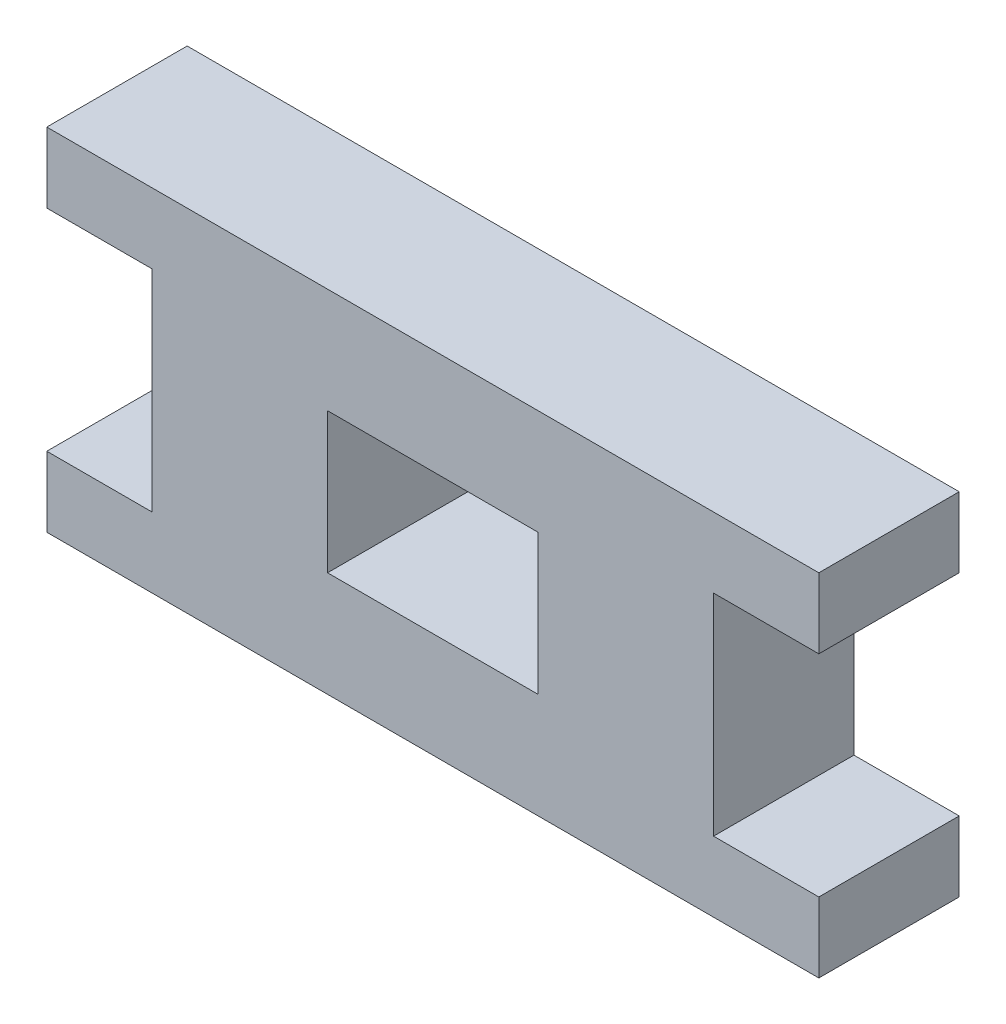
ISO-10303-21;
HEADER;
FILE_DESCRIPTION(('STEP AP214'),'2;1');
FILE_NAME('part.step','',(''),(''),'','','');
FILE_SCHEMA(('AUTOMOTIVE_DESIGN { 1 0 10303 214 1 1 1 1 }'));
ENDSEC;
DATA;
#1=APPLICATION_CONTEXT('core data for automotive mechanical design processes');
#2=APPLICATION_PROTOCOL_DEFINITION('international standard','automotive_design',2000,#1);
#3=PRODUCT_CONTEXT('',#1,'mechanical');
#4=PRODUCT('Part','Part','',(#3));
#5=PRODUCT_RELATED_PRODUCT_CATEGORY('part','',(#4));
#6=PRODUCT_DEFINITION_FORMATION('','',#4);
#7=PRODUCT_DEFINITION_CONTEXT('part definition',#1,'design');
#8=PRODUCT_DEFINITION('design','',#6,#7);
#9=PRODUCT_DEFINITION_SHAPE('','',#8);
#10=(LENGTH_UNIT() NAMED_UNIT(*) SI_UNIT(.MILLI.,.METRE.));
#11=(NAMED_UNIT(*) PLANE_ANGLE_UNIT() SI_UNIT($,.RADIAN.));
#12=(NAMED_UNIT(*) SI_UNIT($,.STERADIAN.) SOLID_ANGLE_UNIT());
#13=UNCERTAINTY_MEASURE_WITH_UNIT(LENGTH_MEASURE(1.E-05),#10,'distance_accuracy_value','');
#14=(GEOMETRIC_REPRESENTATION_CONTEXT(3) GLOBAL_UNCERTAINTY_ASSIGNED_CONTEXT((#13)) GLOBAL_UNIT_ASSIGNED_CONTEXT((#10,
#11,#12)) REPRESENTATION_CONTEXT('',''));
#15=CARTESIAN_POINT('',(0.,0.,0.));
#16=DIRECTION('',(0.,0.,1.));
#17=DIRECTION('',(1.,0.,0.));
#18=AXIS2_PLACEMENT_3D('',#15,#16,#17);
#19=CARTESIAN_POINT('',(0.,0.,20.));
#20=DIRECTION('',(0.,0.,-1.));
#21=DIRECTION('',(-1.,0.,0.));
#22=AXIS2_PLACEMENT_3D('',#19,#20,#21);
#23=PLANE('',#22);
#24=DIRECTION('',(-1.,0.,0.));
#25=VECTOR('',#24,1.);
#26=CARTESIAN_POINT('',(40.,25.,20.));
#27=LINE('',#26,#25);
#28=CARTESIAN_POINT('',(55.,25.,20.));
#29=VERTEX_POINT('',#28);
#30=CARTESIAN_POINT('',(-55.,25.,20.));
#31=VERTEX_POINT('',#30);
#32=EDGE_CURVE('E205',#29,#31,#27,.T.);
#33=ORIENTED_EDGE('',*,*,#32,.T.);
#34=DIRECTION('',(0.,-1.,0.));
#35=VECTOR('',#34,1.);
#36=CARTESIAN_POINT('',(-55.,25.,20.));
#37=LINE('',#36,#35);
#38=CARTESIAN_POINT('',(-55.,15.,20.));
#39=VERTEX_POINT('',#38);
#40=EDGE_CURVE('E208',#31,#39,#37,.T.);
#41=ORIENTED_EDGE('',*,*,#40,.T.);
#42=DIRECTION('',(1.,0.,0.));
#43=VECTOR('',#42,1.);
#44=CARTESIAN_POINT('',(-40.,15.,20.));
#45=LINE('',#44,#43);
#46=CARTESIAN_POINT('',(-40.,15.,20.));
#47=VERTEX_POINT('',#46);
#48=EDGE_CURVE('E212',#39,#47,#45,.T.);
#49=ORIENTED_EDGE('',*,*,#48,.T.);
#50=DIRECTION('',(0.,-1.,0.));
#51=VECTOR('',#50,1.);
#52=CARTESIAN_POINT('',(-40.,-15.,20.));
#53=LINE('',#52,#51);
#54=CARTESIAN_POINT('',(-40.,-15.,20.));
#55=VERTEX_POINT('',#54);
#56=EDGE_CURVE('E215',#47,#55,#53,.T.);
#57=ORIENTED_EDGE('',*,*,#56,.T.);
#58=DIRECTION('',(-1.,0.,0.));
#59=VECTOR('',#58,1.);
#60=CARTESIAN_POINT('',(-40.,-15.,20.));
#61=LINE('',#60,#59);
#62=CARTESIAN_POINT('',(-55.,-15.,20.));
#63=VERTEX_POINT('',#62);
#64=EDGE_CURVE('E218',#55,#63,#61,.T.);
#65=ORIENTED_EDGE('',*,*,#64,.T.);
#66=DIRECTION('',(0.,-1.,0.));
#67=VECTOR('',#66,1.);
#68=CARTESIAN_POINT('',(-55.,-25.,20.));
#69=LINE('',#68,#67);
#70=CARTESIAN_POINT('',(-55.,-25.,20.));
#71=VERTEX_POINT('',#70);
#72=EDGE_CURVE('E221',#63,#71,#69,.T.);
#73=ORIENTED_EDGE('',*,*,#72,.T.);
#74=DIRECTION('',(1.,0.,0.));
#75=VECTOR('',#74,1.);
#76=CARTESIAN_POINT('',(-40.,-25.,20.));
#77=LINE('',#76,#75);
#78=CARTESIAN_POINT('',(55.,-25.,20.));
#79=VERTEX_POINT('',#78);
#80=EDGE_CURVE('E224',#71,#79,#77,.T.);
#81=ORIENTED_EDGE('',*,*,#80,.T.);
#82=DIRECTION('',(0.,1.,0.));
#83=VECTOR('',#82,1.);
#84=CARTESIAN_POINT('',(55.,-25.,20.));
#85=LINE('',#84,#83);
#86=CARTESIAN_POINT('',(55.,-15.,20.));
#87=VERTEX_POINT('',#86);
#88=EDGE_CURVE('E227',#79,#87,#85,.T.);
#89=ORIENTED_EDGE('',*,*,#88,.T.);
#90=DIRECTION('',(-1.,0.,0.));
#91=VECTOR('',#90,1.);
#92=CARTESIAN_POINT('',(40.,-15.,20.));
#93=LINE('',#92,#91);
#94=CARTESIAN_POINT('',(40.,-15.,20.));
#95=VERTEX_POINT('',#94);
#96=EDGE_CURVE('E230',#87,#95,#93,.T.);
#97=ORIENTED_EDGE('',*,*,#96,.T.);
#98=DIRECTION('',(0.,1.,0.));
#99=VECTOR('',#98,1.);
#100=CARTESIAN_POINT('',(40.,-15.,20.));
#101=LINE('',#100,#99);
#102=CARTESIAN_POINT('',(40.,15.,20.));
#103=VERTEX_POINT('',#102);
#104=EDGE_CURVE('E233',#95,#103,#101,.T.);
#105=ORIENTED_EDGE('',*,*,#104,.T.);
#106=DIRECTION('',(1.,0.,0.));
#107=VECTOR('',#106,1.);
#108=CARTESIAN_POINT('',(40.,15.,20.));
#109=LINE('',#108,#107);
#110=CARTESIAN_POINT('',(55.,15.,20.));
#111=VERTEX_POINT('',#110);
#112=EDGE_CURVE('E236',#103,#111,#109,.T.);
#113=ORIENTED_EDGE('',*,*,#112,.T.);
#114=DIRECTION('',(0.,1.,0.));
#115=VECTOR('',#114,1.);
#116=CARTESIAN_POINT('',(55.,25.,20.));
#117=LINE('',#116,#115);
#118=EDGE_CURVE('E239',#111,#29,#117,.T.);
#119=ORIENTED_EDGE('',*,*,#118,.T.);
#120=EDGE_LOOP('',(#33,#41,#49,#57,#65,#73,#81,#89,#97,#105,#113,#119));
#121=FACE_BOUND('',#120,.T.);
#122=DIRECTION('',(0.,1.,0.));
#123=VECTOR('',#122,1.);
#124=CARTESIAN_POINT('',(15.,10.,20.));
#125=LINE('',#124,#123);
#126=CARTESIAN_POINT('',(15.,-10.,20.));
#127=VERTEX_POINT('',#126);
#128=CARTESIAN_POINT('',(15.,10.,20.));
#129=VERTEX_POINT('',#128);
#130=EDGE_CURVE('E157',#127,#129,#125,.T.);
#131=ORIENTED_EDGE('',*,*,#130,.F.);
#132=DIRECTION('',(1.,0.,0.));
#133=VECTOR('',#132,1.);
#134=CARTESIAN_POINT('',(-15.,-10.,20.));
#135=LINE('',#134,#133);
#136=CARTESIAN_POINT('',(-15.,-10.,20.));
#137=VERTEX_POINT('',#136);
#138=EDGE_CURVE('E183',#137,#127,#135,.T.);
#139=ORIENTED_EDGE('',*,*,#138,.F.);
#140=DIRECTION('',(0.,-1.,0.));
#141=VECTOR('',#140,1.);
#142=CARTESIAN_POINT('',(-15.,10.,20.));
#143=LINE('',#142,#141);
#144=CARTESIAN_POINT('',(-15.,10.,20.));
#145=VERTEX_POINT('',#144);
#146=EDGE_CURVE('E179',#145,#137,#143,.T.);
#147=ORIENTED_EDGE('',*,*,#146,.F.);
#148=DIRECTION('',(-1.,0.,0.));
#149=VECTOR('',#148,1.);
#150=CARTESIAN_POINT('',(-15.,10.,20.));
#151=LINE('',#150,#149);
#152=EDGE_CURVE('E166',#129,#145,#151,.T.);
#153=ORIENTED_EDGE('',*,*,#152,.F.);
#154=EDGE_LOOP('',(#131,#139,#147,#153));
#155=FACE_BOUND('',#154,.T.);
#156=ADVANCED_FACE('F43',(#121,#155),#23,.F.);
#157=CARTESIAN_POINT('',(0.,0.,0.));
#158=DIRECTION('',(0.,0.,-1.));
#159=DIRECTION('',(-1.,0.,0.));
#160=AXIS2_PLACEMENT_3D('',#157,#158,#159);
#161=PLANE('',#160);
#162=DIRECTION('',(-1.,0.,0.));
#163=VECTOR('',#162,1.);
#164=CARTESIAN_POINT('',(-40.,25.,0.));
#165=LINE('',#164,#163);
#166=CARTESIAN_POINT('',(55.,25.,0.));
#167=VERTEX_POINT('',#166);
#168=CARTESIAN_POINT('',(-55.,25.,0.));
#169=VERTEX_POINT('',#168);
#170=EDGE_CURVE('E175',#167,#169,#165,.T.);
#171=ORIENTED_EDGE('',*,*,#170,.F.);
#172=DIRECTION('',(0.,1.,0.));
#173=VECTOR('',#172,1.);
#174=CARTESIAN_POINT('',(55.,25.,0.));
#175=LINE('',#174,#173);
#176=CARTESIAN_POINT('',(55.,15.,0.));
#177=VERTEX_POINT('',#176);
#178=EDGE_CURVE('E209',#177,#167,#175,.T.);
#179=ORIENTED_EDGE('',*,*,#178,.F.);
#180=DIRECTION('',(1.,0.,0.));
#181=VECTOR('',#180,1.);
#182=CARTESIAN_POINT('',(40.,15.,0.));
#183=LINE('',#182,#181);
#184=CARTESIAN_POINT('',(40.,15.,0.));
#185=VERTEX_POINT('',#184);
#186=EDGE_CURVE('E273',#185,#177,#183,.T.);
#187=ORIENTED_EDGE('',*,*,#186,.F.);
#188=DIRECTION('',(0.,1.,0.));
#189=VECTOR('',#188,1.);
#190=CARTESIAN_POINT('',(40.,-15.,0.));
#191=LINE('',#190,#189);
#192=CARTESIAN_POINT('',(40.,-15.,0.));
#193=VERTEX_POINT('',#192);
#194=EDGE_CURVE('E270',#193,#185,#191,.T.);
#195=ORIENTED_EDGE('',*,*,#194,.F.);
#196=DIRECTION('',(-1.,0.,0.));
#197=VECTOR('',#196,1.);
#198=CARTESIAN_POINT('',(40.,-15.,0.));
#199=LINE('',#198,#197);
#200=CARTESIAN_POINT('',(55.,-15.,0.));
#201=VERTEX_POINT('',#200);
#202=EDGE_CURVE('E267',#201,#193,#199,.T.);
#203=ORIENTED_EDGE('',*,*,#202,.F.);
#204=DIRECTION('',(0.,1.,0.));
#205=VECTOR('',#204,1.);
#206=CARTESIAN_POINT('',(55.,-25.,0.));
#207=LINE('',#206,#205);
#208=CARTESIAN_POINT('',(55.,-25.,0.));
#209=VERTEX_POINT('',#208);
#210=EDGE_CURVE('E264',#209,#201,#207,.T.);
#211=ORIENTED_EDGE('',*,*,#210,.F.);
#212=DIRECTION('',(1.,0.,0.));
#213=VECTOR('',#212,1.);
#214=CARTESIAN_POINT('',(40.,-25.,0.));
#215=LINE('',#214,#213);
#216=CARTESIAN_POINT('',(-55.,-25.,0.));
#217=VERTEX_POINT('',#216);
#218=EDGE_CURVE('E261',#217,#209,#215,.T.);
#219=ORIENTED_EDGE('',*,*,#218,.F.);
#220=DIRECTION('',(0.,-1.,0.));
#221=VECTOR('',#220,1.);
#222=CARTESIAN_POINT('',(-55.,-25.,0.));
#223=LINE('',#222,#221);
#224=CARTESIAN_POINT('',(-55.,-15.,0.));
#225=VERTEX_POINT('',#224);
#226=EDGE_CURVE('E257',#225,#217,#223,.T.);
#227=ORIENTED_EDGE('',*,*,#226,.F.);
#228=DIRECTION('',(-1.,0.,0.));
#229=VECTOR('',#228,1.);
#230=CARTESIAN_POINT('',(-40.,-15.,0.));
#231=LINE('',#230,#229);
#232=CARTESIAN_POINT('',(-40.,-15.,0.));
#233=VERTEX_POINT('',#232);
#234=EDGE_CURVE('E254',#233,#225,#231,.T.);
#235=ORIENTED_EDGE('',*,*,#234,.F.);
#236=DIRECTION('',(0.,-1.,0.));
#237=VECTOR('',#236,1.);
#238=CARTESIAN_POINT('',(-40.,-15.,0.));
#239=LINE('',#238,#237);
#240=CARTESIAN_POINT('',(-40.,15.,0.));
#241=VERTEX_POINT('',#240);
#242=EDGE_CURVE('E251',#241,#233,#239,.T.);
#243=ORIENTED_EDGE('',*,*,#242,.F.);
#244=DIRECTION('',(1.,0.,0.));
#245=VECTOR('',#244,1.);
#246=CARTESIAN_POINT('',(-40.,15.,0.));
#247=LINE('',#246,#245);
#248=CARTESIAN_POINT('',(-55.,15.,0.));
#249=VERTEX_POINT('',#248);
#250=EDGE_CURVE('E248',#249,#241,#247,.T.);
#251=ORIENTED_EDGE('',*,*,#250,.F.);
#252=DIRECTION('',(0.,-1.,0.));
#253=VECTOR('',#252,1.);
#254=CARTESIAN_POINT('',(-55.,25.,0.));
#255=LINE('',#254,#253);
#256=EDGE_CURVE('E245',#169,#249,#255,.T.);
#257=ORIENTED_EDGE('',*,*,#256,.F.);
#258=EDGE_LOOP('',(#171,#179,#187,#195,#203,#211,#219,#227,#235,#243,#251,#257));
#259=FACE_BOUND('',#258,.T.);
#260=DIRECTION('',(1.,0.,0.));
#261=VECTOR('',#260,1.);
#262=CARTESIAN_POINT('',(-15.,-10.,0.));
#263=LINE('',#262,#261);
#264=CARTESIAN_POINT('',(-15.,-10.,0.));
#265=VERTEX_POINT('',#264);
#266=CARTESIAN_POINT('',(15.,-10.,0.));
#267=VERTEX_POINT('',#266);
#268=EDGE_CURVE('E167',#265,#267,#263,.T.);
#269=ORIENTED_EDGE('',*,*,#268,.T.);
#270=DIRECTION('',(0.,1.,0.));
#271=VECTOR('',#270,1.);
#272=CARTESIAN_POINT('',(15.,10.,0.));
#273=LINE('',#272,#271);
#274=CARTESIAN_POINT('',(15.,10.,0.));
#275=VERTEX_POINT('',#274);
#276=EDGE_CURVE('E67',#267,#275,#273,.T.);
#277=ORIENTED_EDGE('',*,*,#276,.T.);
#278=DIRECTION('',(-1.,0.,0.));
#279=VECTOR('',#278,1.);
#280=CARTESIAN_POINT('',(-15.,10.,0.));
#281=LINE('',#280,#279);
#282=CARTESIAN_POINT('',(-15.,10.,0.));
#283=VERTEX_POINT('',#282);
#284=EDGE_CURVE('E173',#275,#283,#281,.T.);
#285=ORIENTED_EDGE('',*,*,#284,.T.);
#286=DIRECTION('',(0.,-1.,0.));
#287=VECTOR('',#286,1.);
#288=CARTESIAN_POINT('',(-15.,10.,0.));
#289=LINE('',#288,#287);
#290=EDGE_CURVE('E192',#283,#265,#289,.T.);
#291=ORIENTED_EDGE('',*,*,#290,.T.);
#292=EDGE_LOOP('',(#269,#277,#285,#291));
#293=FACE_BOUND('',#292,.T.);
#294=ADVANCED_FACE('F330',(#259,#293),#161,.T.);
#295=CARTESIAN_POINT('',(-40.,25.,20.));
#296=DIRECTION('',(0.,-1.,0.));
#297=DIRECTION('',(0.,0.,-1.));
#298=AXIS2_PLACEMENT_3D('',#295,#296,#297);
#299=PLANE('',#298);
#300=ORIENTED_EDGE('',*,*,#170,.T.);
#301=DIRECTION('',(0.,0.,-1.));
#302=VECTOR('',#301,1.);
#303=CARTESIAN_POINT('',(-55.,25.,20.));
#304=LINE('',#303,#302);
#305=EDGE_CURVE('E11',#31,#169,#304,.T.);
#306=ORIENTED_EDGE('',*,*,#305,.F.);
#307=ORIENTED_EDGE('',*,*,#32,.F.);
#308=DIRECTION('',(0.,0.,-1.));
#309=VECTOR('',#308,1.);
#310=CARTESIAN_POINT('',(55.,25.,20.));
#311=LINE('',#310,#309);
#312=EDGE_CURVE('E242',#29,#167,#311,.T.);
#313=ORIENTED_EDGE('',*,*,#312,.T.);
#314=EDGE_LOOP('',(#300,#306,#307,#313));
#315=FACE_BOUND('',#314,.T.);
#316=ADVANCED_FACE('F45',(#315),#299,.F.);
#317=CARTESIAN_POINT('',(-55.,25.,20.));
#318=DIRECTION('',(1.,0.,0.));
#319=DIRECTION('',(0.,0.,-1.));
#320=AXIS2_PLACEMENT_3D('',#317,#318,#319);
#321=PLANE('',#320);
#322=ORIENTED_EDGE('',*,*,#256,.T.);
#323=DIRECTION('',(0.,0.,-1.));
#324=VECTOR('',#323,1.);
#325=CARTESIAN_POINT('',(-55.,15.,20.));
#326=LINE('',#325,#324);
#327=EDGE_CURVE('E52',#39,#249,#326,.T.);
#328=ORIENTED_EDGE('',*,*,#327,.F.);
#329=ORIENTED_EDGE('',*,*,#40,.F.);
#330=ORIENTED_EDGE('',*,*,#305,.T.);
#331=EDGE_LOOP('',(#322,#328,#329,#330));
#332=FACE_BOUND('',#331,.T.);
#333=ADVANCED_FACE('F347',(#332),#321,.F.);
#334=CARTESIAN_POINT('',(-40.,15.,20.));
#335=DIRECTION('',(0.,1.,0.));
#336=DIRECTION('',(0.,0.,1.));
#337=AXIS2_PLACEMENT_3D('',#334,#335,#336);
#338=PLANE('',#337);
#339=ORIENTED_EDGE('',*,*,#250,.T.);
#340=DIRECTION('',(0.,0.,-1.));
#341=VECTOR('',#340,1.);
#342=CARTESIAN_POINT('',(-40.,15.,20.));
#343=LINE('',#342,#341);
#344=EDGE_CURVE('E314',#47,#241,#343,.T.);
#345=ORIENTED_EDGE('',*,*,#344,.F.);
#346=ORIENTED_EDGE('',*,*,#48,.F.);
#347=ORIENTED_EDGE('',*,*,#327,.T.);
#348=EDGE_LOOP('',(#339,#345,#346,#347));
#349=FACE_BOUND('',#348,.T.);
#350=ADVANCED_FACE('F323',(#349),#338,.F.);
#351=CARTESIAN_POINT('',(-40.,-15.,20.));
#352=DIRECTION('',(1.,0.,0.));
#353=DIRECTION('',(0.,0.,-1.));
#354=AXIS2_PLACEMENT_3D('',#351,#352,#353);
#355=PLANE('',#354);
#356=ORIENTED_EDGE('',*,*,#242,.T.);
#357=DIRECTION('',(0.,0.,-1.));
#358=VECTOR('',#357,1.);
#359=CARTESIAN_POINT('',(-40.,-15.,20.));
#360=LINE('',#359,#358);
#361=EDGE_CURVE('E310',#55,#233,#360,.T.);
#362=ORIENTED_EDGE('',*,*,#361,.F.);
#363=ORIENTED_EDGE('',*,*,#56,.F.);
#364=ORIENTED_EDGE('',*,*,#344,.T.);
#365=EDGE_LOOP('',(#356,#362,#363,#364));
#366=FACE_BOUND('',#365,.T.);
#367=ADVANCED_FACE('F336',(#366),#355,.F.);
#368=CARTESIAN_POINT('',(-40.,-15.,20.));
#369=DIRECTION('',(0.,-1.,0.));
#370=DIRECTION('',(0.,0.,-1.));
#371=AXIS2_PLACEMENT_3D('',#368,#369,#370);
#372=PLANE('',#371);
#373=ORIENTED_EDGE('',*,*,#234,.T.);
#374=DIRECTION('',(0.,0.,-1.));
#375=VECTOR('',#374,1.);
#376=CARTESIAN_POINT('',(-55.,-15.,20.));
#377=LINE('',#376,#375);
#378=EDGE_CURVE('E306',#63,#225,#377,.T.);
#379=ORIENTED_EDGE('',*,*,#378,.F.);
#380=ORIENTED_EDGE('',*,*,#64,.F.);
#381=ORIENTED_EDGE('',*,*,#361,.T.);
#382=EDGE_LOOP('',(#373,#379,#380,#381));
#383=FACE_BOUND('',#382,.T.);
#384=ADVANCED_FACE('F340',(#383),#372,.F.);
#385=CARTESIAN_POINT('',(-55.,-25.,20.));
#386=DIRECTION('',(1.,0.,0.));
#387=DIRECTION('',(0.,0.,-1.));
#388=AXIS2_PLACEMENT_3D('',#385,#386,#387);
#389=PLANE('',#388);
#390=ORIENTED_EDGE('',*,*,#226,.T.);
#391=DIRECTION('',(0.,0.,-1.));
#392=VECTOR('',#391,1.);
#393=CARTESIAN_POINT('',(-55.,-25.,20.));
#394=LINE('',#393,#392);
#395=EDGE_CURVE('E302',#71,#217,#394,.T.);
#396=ORIENTED_EDGE('',*,*,#395,.F.);
#397=ORIENTED_EDGE('',*,*,#72,.F.);
#398=ORIENTED_EDGE('',*,*,#378,.T.);
#399=EDGE_LOOP('',(#390,#396,#397,#398));
#400=FACE_BOUND('',#399,.T.);
#401=ADVANCED_FACE('F377',(#400),#389,.F.);
#402=CARTESIAN_POINT('',(40.,-25.,20.));
#403=DIRECTION('',(0.,1.,0.));
#404=DIRECTION('',(0.,0.,1.));
#405=AXIS2_PLACEMENT_3D('',#402,#403,#404);
#406=PLANE('',#405);
#407=ORIENTED_EDGE('',*,*,#218,.T.);
#408=DIRECTION('',(0.,0.,-1.));
#409=VECTOR('',#408,1.);
#410=CARTESIAN_POINT('',(55.,-25.,20.));
#411=LINE('',#410,#409);
#412=EDGE_CURVE('E298',#79,#209,#411,.T.);
#413=ORIENTED_EDGE('',*,*,#412,.F.);
#414=ORIENTED_EDGE('',*,*,#80,.F.);
#415=ORIENTED_EDGE('',*,*,#395,.T.);
#416=EDGE_LOOP('',(#407,#413,#414,#415));
#417=FACE_BOUND('',#416,.T.);
#418=ADVANCED_FACE('F379',(#417),#406,.F.);
#419=CARTESIAN_POINT('',(55.,-25.,20.));
#420=DIRECTION('',(-1.,0.,0.));
#421=DIRECTION('',(0.,0.,1.));
#422=AXIS2_PLACEMENT_3D('',#419,#420,#421);
#423=PLANE('',#422);
#424=ORIENTED_EDGE('',*,*,#210,.T.);
#425=DIRECTION('',(0.,0.,-1.));
#426=VECTOR('',#425,1.);
#427=CARTESIAN_POINT('',(55.,-15.,20.));
#428=LINE('',#427,#426);
#429=EDGE_CURVE('E294',#87,#201,#428,.T.);
#430=ORIENTED_EDGE('',*,*,#429,.F.);
#431=ORIENTED_EDGE('',*,*,#88,.F.);
#432=ORIENTED_EDGE('',*,*,#412,.T.);
#433=EDGE_LOOP('',(#424,#430,#431,#432));
#434=FACE_BOUND('',#433,.T.);
#435=ADVANCED_FACE('F373',(#434),#423,.F.);
#436=CARTESIAN_POINT('',(40.,-15.,20.));
#437=DIRECTION('',(0.,-1.,0.));
#438=DIRECTION('',(0.,0.,-1.));
#439=AXIS2_PLACEMENT_3D('',#436,#437,#438);
#440=PLANE('',#439);
#441=ORIENTED_EDGE('',*,*,#202,.T.);
#442=DIRECTION('',(0.,0.,-1.));
#443=VECTOR('',#442,1.);
#444=CARTESIAN_POINT('',(40.,-15.,20.));
#445=LINE('',#444,#443);
#446=EDGE_CURVE('E290',#95,#193,#445,.T.);
#447=ORIENTED_EDGE('',*,*,#446,.F.);
#448=ORIENTED_EDGE('',*,*,#96,.F.);
#449=ORIENTED_EDGE('',*,*,#429,.T.);
#450=EDGE_LOOP('',(#441,#447,#448,#449));
#451=FACE_BOUND('',#450,.T.);
#452=ADVANCED_FACE('F369',(#451),#440,.F.);
#453=CARTESIAN_POINT('',(40.,-15.,20.));
#454=DIRECTION('',(-1.,0.,0.));
#455=DIRECTION('',(0.,0.,1.));
#456=AXIS2_PLACEMENT_3D('',#453,#454,#455);
#457=PLANE('',#456);
#458=ORIENTED_EDGE('',*,*,#194,.T.);
#459=DIRECTION('',(0.,0.,-1.));
#460=VECTOR('',#459,1.);
#461=CARTESIAN_POINT('',(40.,15.,20.));
#462=LINE('',#461,#460);
#463=EDGE_CURVE('E286',#103,#185,#462,.T.);
#464=ORIENTED_EDGE('',*,*,#463,.F.);
#465=ORIENTED_EDGE('',*,*,#104,.F.);
#466=ORIENTED_EDGE('',*,*,#446,.T.);
#467=EDGE_LOOP('',(#458,#464,#465,#466));
#468=FACE_BOUND('',#467,.T.);
#469=ADVANCED_FACE('F364',(#468),#457,.F.);
#470=CARTESIAN_POINT('',(40.,15.,20.));
#471=DIRECTION('',(0.,1.,0.));
#472=DIRECTION('',(0.,0.,1.));
#473=AXIS2_PLACEMENT_3D('',#470,#471,#472);
#474=PLANE('',#473);
#475=ORIENTED_EDGE('',*,*,#186,.T.);
#476=DIRECTION('',(0.,0.,-1.));
#477=VECTOR('',#476,1.);
#478=CARTESIAN_POINT('',(55.,15.,20.));
#479=LINE('',#478,#477);
#480=EDGE_CURVE('E282',#111,#177,#479,.T.);
#481=ORIENTED_EDGE('',*,*,#480,.F.);
#482=ORIENTED_EDGE('',*,*,#112,.F.);
#483=ORIENTED_EDGE('',*,*,#463,.T.);
#484=EDGE_LOOP('',(#475,#481,#482,#483));
#485=FACE_BOUND('',#484,.T.);
#486=ADVANCED_FACE('F358',(#485),#474,.F.);
#487=CARTESIAN_POINT('',(55.,25.,20.));
#488=DIRECTION('',(-1.,0.,0.));
#489=DIRECTION('',(0.,0.,1.));
#490=AXIS2_PLACEMENT_3D('',#487,#488,#489);
#491=PLANE('',#490);
#492=ORIENTED_EDGE('',*,*,#178,.T.);
#493=ORIENTED_EDGE('',*,*,#312,.F.);
#494=ORIENTED_EDGE('',*,*,#118,.F.);
#495=ORIENTED_EDGE('',*,*,#480,.T.);
#496=EDGE_LOOP('',(#492,#493,#494,#495));
#497=FACE_BOUND('',#496,.T.);
#498=ADVANCED_FACE('F353',(#497),#491,.F.);
#499=CARTESIAN_POINT('',(15.,10.,20.));
#500=DIRECTION('',(-1.,0.,0.));
#501=DIRECTION('',(0.,0.,1.));
#502=AXIS2_PLACEMENT_3D('',#499,#500,#501);
#503=PLANE('',#502);
#504=ORIENTED_EDGE('',*,*,#276,.F.);
#505=DIRECTION('',(0.,0.,-1.));
#506=VECTOR('',#505,1.);
#507=CARTESIAN_POINT('',(15.,-10.,20.));
#508=LINE('',#507,#506);
#509=EDGE_CURVE('E161',#127,#267,#508,.T.);
#510=ORIENTED_EDGE('',*,*,#509,.F.);
#511=ORIENTED_EDGE('',*,*,#130,.T.);
#512=DIRECTION('',(0.,0.,-1.));
#513=VECTOR('',#512,1.);
#514=CARTESIAN_POINT('',(15.,10.,20.));
#515=LINE('',#514,#513);
#516=EDGE_CURVE('E160',#129,#275,#515,.T.);
#517=ORIENTED_EDGE('',*,*,#516,.T.);
#518=EDGE_LOOP('',(#504,#510,#511,#517));
#519=FACE_BOUND('',#518,.T.);
#520=ADVANCED_FACE('F159',(#519),#503,.T.);
#521=CARTESIAN_POINT('',(-15.,10.,20.));
#522=DIRECTION('',(0.,-1.,0.));
#523=DIRECTION('',(0.,0.,-1.));
#524=AXIS2_PLACEMENT_3D('',#521,#522,#523);
#525=PLANE('',#524);
#526=ORIENTED_EDGE('',*,*,#284,.F.);
#527=ORIENTED_EDGE('',*,*,#516,.F.);
#528=ORIENTED_EDGE('',*,*,#152,.T.);
#529=DIRECTION('',(0.,0.,-1.));
#530=VECTOR('',#529,1.);
#531=CARTESIAN_POINT('',(-15.,10.,20.));
#532=LINE('',#531,#530);
#533=EDGE_CURVE('E176',#145,#283,#532,.T.);
#534=ORIENTED_EDGE('',*,*,#533,.T.);
#535=EDGE_LOOP('',(#526,#527,#528,#534));
#536=FACE_BOUND('',#535,.T.);
#537=ADVANCED_FACE('F170',(#536),#525,.T.);
#538=CARTESIAN_POINT('',(-15.,10.,20.));
#539=DIRECTION('',(1.,0.,0.));
#540=DIRECTION('',(0.,0.,-1.));
#541=AXIS2_PLACEMENT_3D('',#538,#539,#540);
#542=PLANE('',#541);
#543=ORIENTED_EDGE('',*,*,#290,.F.);
#544=ORIENTED_EDGE('',*,*,#533,.F.);
#545=ORIENTED_EDGE('',*,*,#146,.T.);
#546=DIRECTION('',(0.,0.,-1.));
#547=VECTOR('',#546,1.);
#548=CARTESIAN_POINT('',(-15.,-10.,20.));
#549=LINE('',#548,#547);
#550=EDGE_CURVE('E59',#137,#265,#549,.T.);
#551=ORIENTED_EDGE('',*,*,#550,.T.);
#552=EDGE_LOOP('',(#543,#544,#545,#551));
#553=FACE_BOUND('',#552,.T.);
#554=ADVANCED_FACE('F431',(#553),#542,.T.);
#555=CARTESIAN_POINT('',(-15.,-10.,20.));
#556=DIRECTION('',(0.,1.,0.));
#557=DIRECTION('',(0.,0.,1.));
#558=AXIS2_PLACEMENT_3D('',#555,#556,#557);
#559=PLANE('',#558);
#560=ORIENTED_EDGE('',*,*,#268,.F.);
#561=ORIENTED_EDGE('',*,*,#550,.F.);
#562=ORIENTED_EDGE('',*,*,#138,.T.);
#563=ORIENTED_EDGE('',*,*,#509,.T.);
#564=EDGE_LOOP('',(#560,#561,#562,#563));
#565=FACE_BOUND('',#564,.T.);
#566=ADVANCED_FACE('F437',(#565),#559,.T.);
#567=CLOSED_SHELL('',(#156,#294,#316,#333,#350,#367,#384,#401,#418,#435,#452,#469,#486,#498,
#520,#537,#554,#566));
#568=MANIFOLD_SOLID_BREP('B2',#567);
#569=ADVANCED_BREP_SHAPE_REPRESENTATION('',(#18,#568),#14);
#570=SHAPE_DEFINITION_REPRESENTATION(#9,#569);
ENDSEC;
END-ISO-10303-21;
